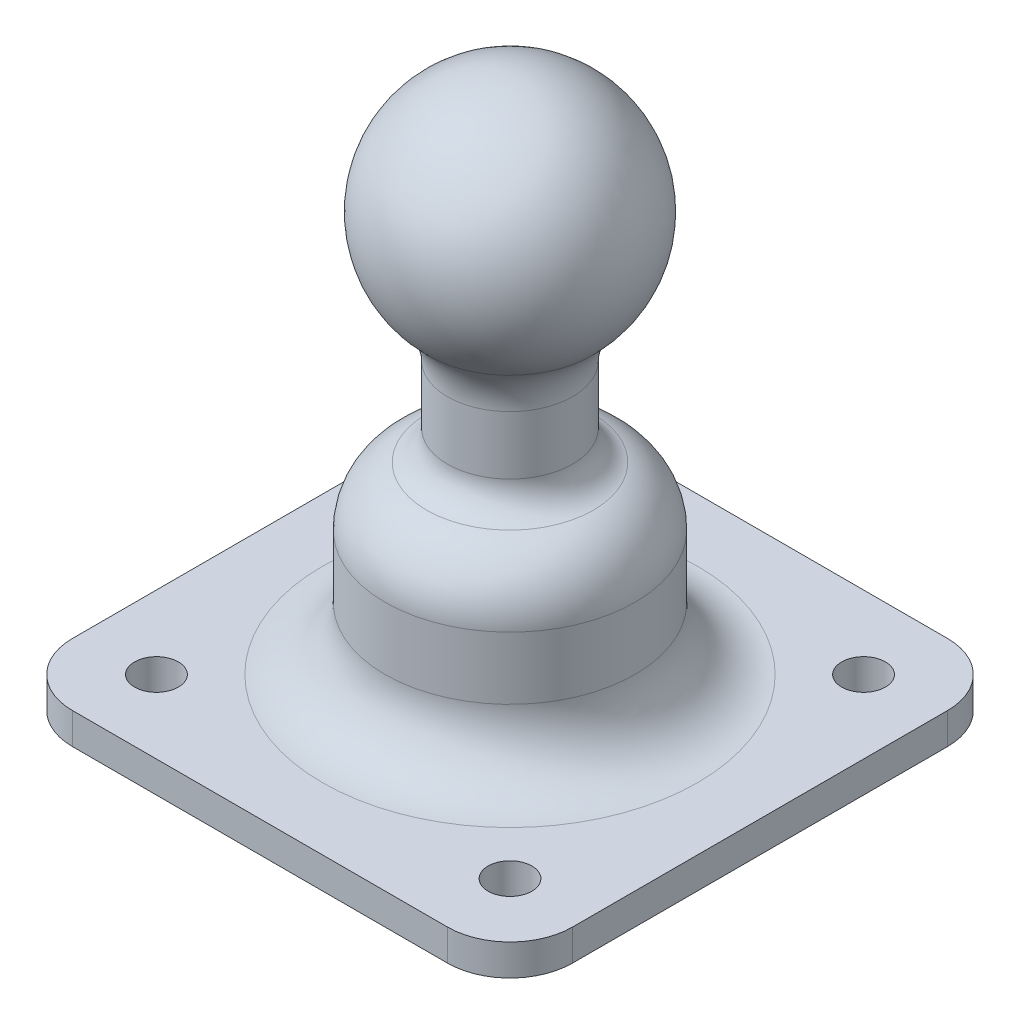
ISO-10303-21;
HEADER;
FILE_DESCRIPTION(('STEP AP214'),'2;1');
FILE_NAME('part.step','',(''),(''),'','','');
FILE_SCHEMA(('AUTOMOTIVE_DESIGN { 1 0 10303 214 1 1 1 1 }'));
ENDSEC;
DATA;
#1=APPLICATION_CONTEXT('core data for automotive mechanical design processes');
#2=APPLICATION_PROTOCOL_DEFINITION('international standard','automotive_design',2000,#1);
#3=PRODUCT_CONTEXT('',#1,'mechanical');
#4=PRODUCT('Part','Part','',(#3));
#5=PRODUCT_RELATED_PRODUCT_CATEGORY('part','',(#4));
#6=PRODUCT_DEFINITION_FORMATION('','',#4);
#7=PRODUCT_DEFINITION_CONTEXT('part definition',#1,'design');
#8=PRODUCT_DEFINITION('design','',#6,#7);
#9=PRODUCT_DEFINITION_SHAPE('','',#8);
#10=(LENGTH_UNIT() NAMED_UNIT(*) SI_UNIT(.MILLI.,.METRE.));
#11=(NAMED_UNIT(*) PLANE_ANGLE_UNIT() SI_UNIT($,.RADIAN.));
#12=(NAMED_UNIT(*) SI_UNIT($,.STERADIAN.) SOLID_ANGLE_UNIT());
#13=UNCERTAINTY_MEASURE_WITH_UNIT(LENGTH_MEASURE(1.E-05),#10,'distance_accuracy_value','');
#14=(GEOMETRIC_REPRESENTATION_CONTEXT(3) GLOBAL_UNCERTAINTY_ASSIGNED_CONTEXT((#13)) GLOBAL_UNIT_ASSIGNED_CONTEXT((#10,
#11,#12)) REPRESENTATION_CONTEXT('',''));
#15=CARTESIAN_POINT('',(0.,0.,0.));
#16=DIRECTION('',(0.,0.,1.));
#17=DIRECTION('',(1.,0.,0.));
#18=AXIS2_PLACEMENT_3D('',#15,#16,#17);
#19=CARTESIAN_POINT('',(-30.,5.,30.));
#20=DIRECTION('',(0.,1.,0.));
#21=DIRECTION('',(0.,0.,1.));
#22=AXIS2_PLACEMENT_3D('',#19,#20,#21);
#23=PLANE('',#22);
#24=CARTESIAN_POINT('',(0.,5.,0.));
#25=DIRECTION('',(0.,1.,0.));
#26=DIRECTION('',(0.,0.,1.));
#27=AXIS2_PLACEMENT_3D('',#24,#25,#26);
#28=CIRCLE('',#27,30.);
#29=CARTESIAN_POINT('',(0.,5.,30.));
#30=VERTEX_POINT('',#29);
#31=EDGE_CURVE('E171',#30,#30,#28,.F.);
#32=ORIENTED_EDGE('',*,*,#31,.T.);
#33=EDGE_LOOP('',(#32));
#34=FACE_BOUND('',#33,.T.);
#35=CARTESIAN_POINT('',(28.2842712474619,5.,28.2842712474619));
#36=DIRECTION('',(0.,1.,0.));
#37=DIRECTION('',(0.,0.,1.));
#38=AXIS2_PLACEMENT_3D('',#35,#36,#37);
#39=CIRCLE('',#38,3.5);
#40=CARTESIAN_POINT('',(28.2842712474619,5.,31.7842712474619));
#41=VERTEX_POINT('',#40);
#42=EDGE_CURVE('E285',#41,#41,#39,.T.);
#43=ORIENTED_EDGE('',*,*,#42,.F.);
#44=EDGE_LOOP('',(#43));
#45=FACE_BOUND('',#44,.T.);
#46=CARTESIAN_POINT('',(-28.2842712474619,5.,-28.2842712474619));
#47=DIRECTION('',(0.,1.,0.));
#48=DIRECTION('',(0.,0.,1.));
#49=AXIS2_PLACEMENT_3D('',#46,#47,#48);
#50=CIRCLE('',#49,3.5);
#51=CARTESIAN_POINT('',(-28.2842712474619,5.,-24.7842712474619));
#52=VERTEX_POINT('',#51);
#53=EDGE_CURVE('E139',#52,#52,#50,.T.);
#54=ORIENTED_EDGE('',*,*,#53,.F.);
#55=EDGE_LOOP('',(#54));
#56=FACE_BOUND('',#55,.T.);
#57=CARTESIAN_POINT('',(-30.,5.,30.));
#58=DIRECTION('',(0.,1.,0.));
#59=DIRECTION('',(0.,0.,1.));
#60=AXIS2_PLACEMENT_3D('',#57,#58,#59);
#61=CIRCLE('',#60,10.);
#62=CARTESIAN_POINT('',(-40.,5.,29.9999999999999));
#63=VERTEX_POINT('',#62);
#64=CARTESIAN_POINT('',(-29.9999999999999,5.,40.));
#65=VERTEX_POINT('',#64);
#66=EDGE_CURVE('E150',#63,#65,#61,.T.);
#67=ORIENTED_EDGE('',*,*,#66,.T.);
#68=DIRECTION('',(1.,0.,0.));
#69=VECTOR('',#68,1.);
#70=CARTESIAN_POINT('',(-29.9999999999999,5.,40.));
#71=LINE('',#70,#69);
#72=CARTESIAN_POINT('',(29.9999999999999,5.,40.));
#73=VERTEX_POINT('',#72);
#74=EDGE_CURVE('E98',#65,#73,#71,.T.);
#75=ORIENTED_EDGE('',*,*,#74,.T.);
#76=CARTESIAN_POINT('',(30.,5.,30.));
#77=DIRECTION('',(0.,1.,0.));
#78=DIRECTION('',(0.,0.,1.));
#79=AXIS2_PLACEMENT_3D('',#76,#77,#78);
#80=CIRCLE('',#79,10.);
#81=CARTESIAN_POINT('',(40.,5.,29.9999999999999));
#82=VERTEX_POINT('',#81);
#83=EDGE_CURVE('E300',#73,#82,#80,.T.);
#84=ORIENTED_EDGE('',*,*,#83,.T.);
#85=DIRECTION('',(0.,0.,-1.));
#86=VECTOR('',#85,1.);
#87=CARTESIAN_POINT('',(40.,5.,-29.9999999999999));
#88=LINE('',#87,#86);
#89=CARTESIAN_POINT('',(40.,5.,-29.9999999999999));
#90=VERTEX_POINT('',#89);
#91=EDGE_CURVE('E302',#82,#90,#88,.T.);
#92=ORIENTED_EDGE('',*,*,#91,.T.);
#93=CARTESIAN_POINT('',(30.,5.,-30.));
#94=DIRECTION('',(0.,1.,0.));
#95=DIRECTION('',(0.,0.,-1.));
#96=AXIS2_PLACEMENT_3D('',#93,#94,#95);
#97=CIRCLE('',#96,10.);
#98=CARTESIAN_POINT('',(29.9999999999999,5.,-40.));
#99=VERTEX_POINT('',#98);
#100=EDGE_CURVE('E117',#90,#99,#97,.T.);
#101=ORIENTED_EDGE('',*,*,#100,.T.);
#102=DIRECTION('',(-1.,0.,0.));
#103=VECTOR('',#102,1.);
#104=CARTESIAN_POINT('',(-29.9999999999999,5.,-40.));
#105=LINE('',#104,#103);
#106=CARTESIAN_POINT('',(-29.9999999999999,5.,-40.));
#107=VERTEX_POINT('',#106);
#108=EDGE_CURVE('E111',#99,#107,#105,.T.);
#109=ORIENTED_EDGE('',*,*,#108,.T.);
#110=CARTESIAN_POINT('',(-30.,5.,-30.));
#111=DIRECTION('',(0.,1.,0.));
#112=DIRECTION('',(0.,0.,1.));
#113=AXIS2_PLACEMENT_3D('',#110,#111,#112);
#114=CIRCLE('',#113,10.);
#115=CARTESIAN_POINT('',(-40.,5.,-29.9999999999999));
#116=VERTEX_POINT('',#115);
#117=EDGE_CURVE('E115',#107,#116,#114,.T.);
#118=ORIENTED_EDGE('',*,*,#117,.T.);
#119=DIRECTION('',(0.,0.,1.));
#120=VECTOR('',#119,1.);
#121=CARTESIAN_POINT('',(-40.,5.,-29.9999999999999));
#122=LINE('',#121,#120);
#123=EDGE_CURVE('E54',#116,#63,#122,.T.);
#124=ORIENTED_EDGE('',*,*,#123,.T.);
#125=EDGE_LOOP('',(#67,#75,#84,#92,#101,#109,#118,#124));
#126=FACE_BOUND('',#125,.T.);
#127=CARTESIAN_POINT('',(28.2842712474619,5.,-28.2842712474619));
#128=DIRECTION('',(0.,1.,0.));
#129=DIRECTION('',(0.,0.,1.));
#130=AXIS2_PLACEMENT_3D('',#127,#128,#129);
#131=CIRCLE('',#130,3.5);
#132=CARTESIAN_POINT('',(28.2842712474619,5.,-24.7842712474619));
#133=VERTEX_POINT('',#132);
#134=EDGE_CURVE('E280',#133,#133,#131,.T.);
#135=ORIENTED_EDGE('',*,*,#134,.F.);
#136=EDGE_LOOP('',(#135));
#137=FACE_BOUND('',#136,.T.);
#138=CARTESIAN_POINT('',(-28.2842712474619,5.,28.2842712474619));
#139=DIRECTION('',(0.,1.,0.));
#140=DIRECTION('',(0.,0.,1.));
#141=AXIS2_PLACEMENT_3D('',#138,#139,#140);
#142=CIRCLE('',#141,3.5);
#143=CARTESIAN_POINT('',(-28.2842712474619,5.,31.7842712474619));
#144=VERTEX_POINT('',#143);
#145=EDGE_CURVE('E323',#144,#144,#142,.T.);
#146=ORIENTED_EDGE('',*,*,#145,.F.);
#147=EDGE_LOOP('',(#146));
#148=FACE_BOUND('',#147,.T.);
#149=ADVANCED_FACE('F37',(#34,#45,#56,#126,#137,#148),#23,.T.);
#150=CARTESIAN_POINT('',(-30.,0.,30.));
#151=DIRECTION('',(0.,1.,0.));
#152=DIRECTION('',(0.,0.,1.));
#153=AXIS2_PLACEMENT_3D('',#150,#151,#152);
#154=PLANE('',#153);
#155=CARTESIAN_POINT('',(-30.,0.,30.));
#156=DIRECTION('',(0.,1.,0.));
#157=DIRECTION('',(0.,0.,1.));
#158=AXIS2_PLACEMENT_3D('',#155,#156,#157);
#159=CIRCLE('',#158,10.);
#160=CARTESIAN_POINT('',(-40.,0.,29.9999999999999));
#161=VERTEX_POINT('',#160);
#162=CARTESIAN_POINT('',(-29.9999999999999,0.,40.));
#163=VERTEX_POINT('',#162);
#164=EDGE_CURVE('E135',#161,#163,#159,.T.);
#165=ORIENTED_EDGE('',*,*,#164,.F.);
#166=DIRECTION('',(0.,0.,1.));
#167=VECTOR('',#166,1.);
#168=CARTESIAN_POINT('',(-40.,0.,-29.9999999999999));
#169=LINE('',#168,#167);
#170=CARTESIAN_POINT('',(-40.,0.,-29.9999999999999));
#171=VERTEX_POINT('',#170);
#172=EDGE_CURVE('E89',#171,#161,#169,.T.);
#173=ORIENTED_EDGE('',*,*,#172,.F.);
#174=CARTESIAN_POINT('',(-30.,0.,-30.));
#175=DIRECTION('',(0.,1.,0.));
#176=DIRECTION('',(0.,0.,1.));
#177=AXIS2_PLACEMENT_3D('',#174,#175,#176);
#178=CIRCLE('',#177,10.);
#179=CARTESIAN_POINT('',(-29.9999999999999,0.,-40.));
#180=VERTEX_POINT('',#179);
#181=EDGE_CURVE('E83',#180,#171,#178,.T.);
#182=ORIENTED_EDGE('',*,*,#181,.F.);
#183=DIRECTION('',(-1.,0.,0.));
#184=VECTOR('',#183,1.);
#185=CARTESIAN_POINT('',(-29.9999999999999,0.,-40.));
#186=LINE('',#185,#184);
#187=CARTESIAN_POINT('',(29.9999999999999,0.,-40.));
#188=VERTEX_POINT('',#187);
#189=EDGE_CURVE('E125',#188,#180,#186,.T.);
#190=ORIENTED_EDGE('',*,*,#189,.F.);
#191=CARTESIAN_POINT('',(30.,0.,-30.));
#192=DIRECTION('',(0.,1.,0.));
#193=DIRECTION('',(0.,0.,-1.));
#194=AXIS2_PLACEMENT_3D('',#191,#192,#193);
#195=CIRCLE('',#194,10.);
#196=CARTESIAN_POINT('',(40.,0.,-29.9999999999999));
#197=VERTEX_POINT('',#196);
#198=EDGE_CURVE('E145',#197,#188,#195,.T.);
#199=ORIENTED_EDGE('',*,*,#198,.F.);
#200=DIRECTION('',(0.,0.,-1.));
#201=VECTOR('',#200,1.);
#202=CARTESIAN_POINT('',(40.,0.,-29.9999999999999));
#203=LINE('',#202,#201);
#204=CARTESIAN_POINT('',(40.,0.,29.9999999999999));
#205=VERTEX_POINT('',#204);
#206=EDGE_CURVE('E143',#205,#197,#203,.T.);
#207=ORIENTED_EDGE('',*,*,#206,.F.);
#208=CARTESIAN_POINT('',(30.,0.,30.));
#209=DIRECTION('',(0.,1.,0.));
#210=DIRECTION('',(0.,0.,1.));
#211=AXIS2_PLACEMENT_3D('',#208,#209,#210);
#212=CIRCLE('',#211,10.);
#213=CARTESIAN_POINT('',(29.9999999999999,0.,40.));
#214=VERTEX_POINT('',#213);
#215=EDGE_CURVE('E141',#214,#205,#212,.T.);
#216=ORIENTED_EDGE('',*,*,#215,.F.);
#217=DIRECTION('',(1.,0.,0.));
#218=VECTOR('',#217,1.);
#219=CARTESIAN_POINT('',(-29.9999999999999,0.,40.));
#220=LINE('',#219,#218);
#221=EDGE_CURVE('E138',#163,#214,#220,.T.);
#222=ORIENTED_EDGE('',*,*,#221,.F.);
#223=EDGE_LOOP('',(#165,#173,#182,#190,#199,#207,#216,#222));
#224=FACE_BOUND('',#223,.T.);
#225=CARTESIAN_POINT('',(-28.2842712474619,0.,-28.2842712474619));
#226=DIRECTION('',(0.,1.,0.));
#227=DIRECTION('',(0.,0.,1.));
#228=AXIS2_PLACEMENT_3D('',#225,#226,#227);
#229=CIRCLE('',#228,3.5);
#230=CARTESIAN_POINT('',(-28.2842712474619,0.,-24.7842712474619));
#231=VERTEX_POINT('',#230);
#232=EDGE_CURVE('E287',#231,#231,#229,.T.);
#233=ORIENTED_EDGE('',*,*,#232,.T.);
#234=EDGE_LOOP('',(#233));
#235=FACE_BOUND('',#234,.T.);
#236=CARTESIAN_POINT('',(28.2842712474619,0.,-28.2842712474619));
#237=DIRECTION('',(0.,1.,0.));
#238=DIRECTION('',(0.,0.,1.));
#239=AXIS2_PLACEMENT_3D('',#236,#237,#238);
#240=CIRCLE('',#239,3.5);
#241=CARTESIAN_POINT('',(28.2842712474619,0.,-24.7842712474619));
#242=VERTEX_POINT('',#241);
#243=EDGE_CURVE('E283',#242,#242,#240,.T.);
#244=ORIENTED_EDGE('',*,*,#243,.T.);
#245=EDGE_LOOP('',(#244));
#246=FACE_BOUND('',#245,.T.);
#247=CARTESIAN_POINT('',(28.2842712474619,0.,28.2842712474619));
#248=DIRECTION('',(0.,1.,0.));
#249=DIRECTION('',(0.,0.,1.));
#250=AXIS2_PLACEMENT_3D('',#247,#248,#249);
#251=CIRCLE('',#250,3.5);
#252=CARTESIAN_POINT('',(28.2842712474619,0.,31.7842712474619));
#253=VERTEX_POINT('',#252);
#254=EDGE_CURVE('E290',#253,#253,#251,.T.);
#255=ORIENTED_EDGE('',*,*,#254,.T.);
#256=EDGE_LOOP('',(#255));
#257=FACE_BOUND('',#256,.T.);
#258=CARTESIAN_POINT('',(-28.2842712474619,0.,28.2842712474619));
#259=DIRECTION('',(0.,1.,0.));
#260=DIRECTION('',(0.,0.,1.));
#261=AXIS2_PLACEMENT_3D('',#258,#259,#260);
#262=CIRCLE('',#261,3.5);
#263=CARTESIAN_POINT('',(-28.2842712474619,0.,31.7842712474619));
#264=VERTEX_POINT('',#263);
#265=EDGE_CURVE('E321',#264,#264,#262,.T.);
#266=ORIENTED_EDGE('',*,*,#265,.T.);
#267=EDGE_LOOP('',(#266));
#268=FACE_BOUND('',#267,.T.);
#269=ADVANCED_FACE('F196',(#224,#235,#246,#257,#268),#154,.F.);
#270=CARTESIAN_POINT('',(-30.,5.,30.));
#271=DIRECTION('',(0.,-1.,0.));
#272=DIRECTION('',(0.,0.,-1.));
#273=AXIS2_PLACEMENT_3D('',#270,#271,#272);
#274=CYLINDRICAL_SURFACE('',#273,10.);
#275=ORIENTED_EDGE('',*,*,#164,.T.);
#276=DIRECTION('',(0.,-1.,0.));
#277=VECTOR('',#276,1.);
#278=CARTESIAN_POINT('',(-29.9999999999999,5.,40.));
#279=LINE('',#278,#277);
#280=EDGE_CURVE('E163',#65,#163,#279,.T.);
#281=ORIENTED_EDGE('',*,*,#280,.F.);
#282=ORIENTED_EDGE('',*,*,#66,.F.);
#283=DIRECTION('',(0.,-1.,0.));
#284=VECTOR('',#283,1.);
#285=CARTESIAN_POINT('',(-40.,5.,29.9999999999999));
#286=LINE('',#285,#284);
#287=EDGE_CURVE('E131',#63,#161,#286,.T.);
#288=ORIENTED_EDGE('',*,*,#287,.T.);
#289=EDGE_LOOP('',(#275,#281,#282,#288));
#290=FACE_BOUND('',#289,.T.);
#291=ADVANCED_FACE('F202',(#290),#274,.T.);
#292=CARTESIAN_POINT('',(-29.9999999999999,5.,40.));
#293=DIRECTION('',(0.,0.,-1.));
#294=DIRECTION('',(-1.,0.,0.));
#295=AXIS2_PLACEMENT_3D('',#292,#293,#294);
#296=PLANE('',#295);
#297=ORIENTED_EDGE('',*,*,#221,.T.);
#298=DIRECTION('',(0.,-1.,0.));
#299=VECTOR('',#298,1.);
#300=CARTESIAN_POINT('',(29.9999999999999,5.,40.));
#301=LINE('',#300,#299);
#302=EDGE_CURVE('E160',#73,#214,#301,.T.);
#303=ORIENTED_EDGE('',*,*,#302,.F.);
#304=ORIENTED_EDGE('',*,*,#74,.F.);
#305=ORIENTED_EDGE('',*,*,#280,.T.);
#306=EDGE_LOOP('',(#297,#303,#304,#305));
#307=FACE_BOUND('',#306,.T.);
#308=ADVANCED_FACE('F228',(#307),#296,.F.);
#309=CARTESIAN_POINT('',(30.,5.,30.));
#310=DIRECTION('',(0.,-1.,0.));
#311=DIRECTION('',(0.,0.,-1.));
#312=AXIS2_PLACEMENT_3D('',#309,#310,#311);
#313=CYLINDRICAL_SURFACE('',#312,10.);
#314=ORIENTED_EDGE('',*,*,#215,.T.);
#315=DIRECTION('',(0.,-1.,0.));
#316=VECTOR('',#315,1.);
#317=CARTESIAN_POINT('',(40.,5.,29.9999999999999));
#318=LINE('',#317,#316);
#319=EDGE_CURVE('E157',#82,#205,#318,.T.);
#320=ORIENTED_EDGE('',*,*,#319,.F.);
#321=ORIENTED_EDGE('',*,*,#83,.F.);
#322=ORIENTED_EDGE('',*,*,#302,.T.);
#323=EDGE_LOOP('',(#314,#320,#321,#322));
#324=FACE_BOUND('',#323,.T.);
#325=ADVANCED_FACE('F224',(#324),#313,.T.);
#326=CARTESIAN_POINT('',(40.,5.,-29.9999999999999));
#327=DIRECTION('',(-1.,0.,0.));
#328=DIRECTION('',(0.,0.,1.));
#329=AXIS2_PLACEMENT_3D('',#326,#327,#328);
#330=PLANE('',#329);
#331=ORIENTED_EDGE('',*,*,#206,.T.);
#332=DIRECTION('',(0.,-1.,0.));
#333=VECTOR('',#332,1.);
#334=CARTESIAN_POINT('',(40.,5.,-29.9999999999999));
#335=LINE('',#334,#333);
#336=EDGE_CURVE('E154',#90,#197,#335,.T.);
#337=ORIENTED_EDGE('',*,*,#336,.F.);
#338=ORIENTED_EDGE('',*,*,#91,.F.);
#339=ORIENTED_EDGE('',*,*,#319,.T.);
#340=EDGE_LOOP('',(#331,#337,#338,#339));
#341=FACE_BOUND('',#340,.T.);
#342=ADVANCED_FACE('F220',(#341),#330,.F.);
#343=CARTESIAN_POINT('',(30.,5.,-30.));
#344=DIRECTION('',(0.,-1.,0.));
#345=DIRECTION('',(0.,0.,-1.));
#346=AXIS2_PLACEMENT_3D('',#343,#344,#345);
#347=CYLINDRICAL_SURFACE('',#346,10.);
#348=ORIENTED_EDGE('',*,*,#198,.T.);
#349=DIRECTION('',(0.,-1.,0.));
#350=VECTOR('',#349,1.);
#351=CARTESIAN_POINT('',(29.9999999999999,5.,-40.));
#352=LINE('',#351,#350);
#353=EDGE_CURVE('E126',#99,#188,#352,.T.);
#354=ORIENTED_EDGE('',*,*,#353,.F.);
#355=ORIENTED_EDGE('',*,*,#100,.F.);
#356=ORIENTED_EDGE('',*,*,#336,.T.);
#357=EDGE_LOOP('',(#348,#354,#355,#356));
#358=FACE_BOUND('',#357,.T.);
#359=ADVANCED_FACE('F217',(#358),#347,.T.);
#360=CARTESIAN_POINT('',(-29.9999999999999,5.,-40.));
#361=DIRECTION('',(0.,0.,1.));
#362=DIRECTION('',(1.,0.,0.));
#363=AXIS2_PLACEMENT_3D('',#360,#361,#362);
#364=PLANE('',#363);
#365=ORIENTED_EDGE('',*,*,#189,.T.);
#366=DIRECTION('',(0.,-1.,0.));
#367=VECTOR('',#366,1.);
#368=CARTESIAN_POINT('',(-29.9999999999999,5.,-40.));
#369=LINE('',#368,#367);
#370=EDGE_CURVE('E122',#107,#180,#369,.T.);
#371=ORIENTED_EDGE('',*,*,#370,.F.);
#372=ORIENTED_EDGE('',*,*,#108,.F.);
#373=ORIENTED_EDGE('',*,*,#353,.T.);
#374=EDGE_LOOP('',(#365,#371,#372,#373));
#375=FACE_BOUND('',#374,.T.);
#376=ADVANCED_FACE('F123',(#375),#364,.F.);
#377=CARTESIAN_POINT('',(-30.,5.,-30.));
#378=DIRECTION('',(0.,-1.,0.));
#379=DIRECTION('',(0.,0.,-1.));
#380=AXIS2_PLACEMENT_3D('',#377,#378,#379);
#381=CYLINDRICAL_SURFACE('',#380,10.);
#382=ORIENTED_EDGE('',*,*,#181,.T.);
#383=DIRECTION('',(0.,-1.,0.));
#384=VECTOR('',#383,1.);
#385=CARTESIAN_POINT('',(-40.,5.,-29.9999999999999));
#386=LINE('',#385,#384);
#387=EDGE_CURVE('E127',#116,#171,#386,.T.);
#388=ORIENTED_EDGE('',*,*,#387,.F.);
#389=ORIENTED_EDGE('',*,*,#117,.F.);
#390=ORIENTED_EDGE('',*,*,#370,.T.);
#391=EDGE_LOOP('',(#382,#388,#389,#390));
#392=FACE_BOUND('',#391,.T.);
#393=ADVANCED_FACE('F129',(#392),#381,.T.);
#394=CARTESIAN_POINT('',(-40.,5.,-29.9999999999999));
#395=DIRECTION('',(1.,0.,0.));
#396=DIRECTION('',(0.,0.,-1.));
#397=AXIS2_PLACEMENT_3D('',#394,#395,#396);
#398=PLANE('',#397);
#399=ORIENTED_EDGE('',*,*,#172,.T.);
#400=ORIENTED_EDGE('',*,*,#287,.F.);
#401=ORIENTED_EDGE('',*,*,#123,.F.);
#402=ORIENTED_EDGE('',*,*,#387,.T.);
#403=EDGE_LOOP('',(#399,#400,#401,#402));
#404=FACE_BOUND('',#403,.T.);
#405=ADVANCED_FACE('F210',(#404),#398,.F.);
#406=CARTESIAN_POINT('',(-28.2842712474619,5.,-28.2842712474619));
#407=DIRECTION('',(0.,-1.,0.));
#408=DIRECTION('',(0.,0.,-1.));
#409=AXIS2_PLACEMENT_3D('',#406,#407,#408);
#410=CYLINDRICAL_SURFACE('',#409,3.5);
#411=ORIENTED_EDGE('',*,*,#53,.T.);
#412=EDGE_LOOP('',(#411));
#413=FACE_BOUND('',#412,.T.);
#414=ORIENTED_EDGE('',*,*,#232,.F.);
#415=EDGE_LOOP('',(#414));
#416=FACE_BOUND('',#415,.T.);
#417=ADVANCED_FACE('F207',(#413,#416),#410,.F.);
#418=CARTESIAN_POINT('',(28.2842712474619,5.,-28.2842712474619));
#419=DIRECTION('',(0.,-1.,0.));
#420=DIRECTION('',(0.,0.,-1.));
#421=AXIS2_PLACEMENT_3D('',#418,#419,#420);
#422=CYLINDRICAL_SURFACE('',#421,3.5);
#423=ORIENTED_EDGE('',*,*,#134,.T.);
#424=EDGE_LOOP('',(#423));
#425=FACE_BOUND('',#424,.T.);
#426=ORIENTED_EDGE('',*,*,#243,.F.);
#427=EDGE_LOOP('',(#426));
#428=FACE_BOUND('',#427,.T.);
#429=ADVANCED_FACE('F269',(#425,#428),#422,.F.);
#430=CARTESIAN_POINT('',(28.2842712474619,5.,28.2842712474619));
#431=DIRECTION('',(0.,-1.,0.));
#432=DIRECTION('',(0.,0.,-1.));
#433=AXIS2_PLACEMENT_3D('',#430,#431,#432);
#434=CYLINDRICAL_SURFACE('',#433,3.5);
#435=ORIENTED_EDGE('',*,*,#42,.T.);
#436=EDGE_LOOP('',(#435));
#437=FACE_BOUND('',#436,.T.);
#438=ORIENTED_EDGE('',*,*,#254,.F.);
#439=EDGE_LOOP('',(#438));
#440=FACE_BOUND('',#439,.T.);
#441=ADVANCED_FACE('F264',(#437,#440),#434,.F.);
#442=CARTESIAN_POINT('',(-28.2842712474619,5.,28.2842712474619));
#443=DIRECTION('',(0.,-1.,0.));
#444=DIRECTION('',(0.,0.,-1.));
#445=AXIS2_PLACEMENT_3D('',#442,#443,#444);
#446=CYLINDRICAL_SURFACE('',#445,3.5);
#447=ORIENTED_EDGE('',*,*,#145,.T.);
#448=EDGE_LOOP('',(#447));
#449=FACE_BOUND('',#448,.T.);
#450=ORIENTED_EDGE('',*,*,#265,.F.);
#451=EDGE_LOOP('',(#450));
#452=FACE_BOUND('',#451,.T.);
#453=ADVANCED_FACE('F257',(#449,#452),#446,.F.);
#454=CARTESIAN_POINT('',(0.,35.,0.));
#455=DIRECTION('',(0.,-1.,0.));
#456=DIRECTION('',(0.,0.,-1.));
#457=AXIS2_PLACEMENT_3D('',#454,#455,#456);
#458=CYLINDRICAL_SURFACE('',#457,20.);
#459=CARTESIAN_POINT('',(0.,25.,0.));
#460=DIRECTION('',(0.,1.,0.));
#461=DIRECTION('',(0.,0.,1.));
#462=AXIS2_PLACEMENT_3D('',#459,#460,#461);
#463=CIRCLE('',#462,20.);
#464=CARTESIAN_POINT('',(0.,25.,20.));
#465=VERTEX_POINT('',#464);
#466=EDGE_CURVE('E168',#465,#465,#463,.F.);
#467=ORIENTED_EDGE('',*,*,#466,.T.);
#468=EDGE_LOOP('',(#467));
#469=FACE_BOUND('',#468,.T.);
#470=CARTESIAN_POINT('',(0.,15.,0.));
#471=DIRECTION('',(0.,1.,0.));
#472=DIRECTION('',(0.,0.,1.));
#473=AXIS2_PLACEMENT_3D('',#470,#471,#472);
#474=CIRCLE('',#473,20.);
#475=CARTESIAN_POINT('',(0.,15.,20.));
#476=VERTEX_POINT('',#475);
#477=EDGE_CURVE('E165',#476,#476,#474,.T.);
#478=ORIENTED_EDGE('',*,*,#477,.T.);
#479=EDGE_LOOP('',(#478));
#480=FACE_BOUND('',#479,.T.);
#481=ADVANCED_FACE('F239',(#469,#480),#458,.T.);
#482=CARTESIAN_POINT('',(0.,25.,0.));
#483=DIRECTION('',(0.,1.,0.));
#484=DIRECTION('',(0.,0.,1.));
#485=AXIS2_PLACEMENT_3D('',#482,#483,#484);
#486=DEGENERATE_TOROIDAL_SURFACE('',#485,10.,10.,.T.);
#487=CARTESIAN_POINT('',(0.,34.4280904158206,0.));
#488=DIRECTION('',(0.,-1.,0.));
#489=DIRECTION('',(0.,0.,-1.));
#490=AXIS2_PLACEMENT_3D('',#487,#488,#489);
#491=CIRCLE('',#490,13.3333333333333);
#492=CARTESIAN_POINT('',(0.,34.4280904158206,-13.3333333333333));
#493=VERTEX_POINT('',#492);
#494=EDGE_CURVE('E177',#493,#493,#491,.T.);
#495=ORIENTED_EDGE('',*,*,#494,.T.);
#496=EDGE_LOOP('',(#495));
#497=FACE_BOUND('',#496,.T.);
#498=ORIENTED_EDGE('',*,*,#466,.F.);
#499=EDGE_LOOP('',(#498));
#500=FACE_BOUND('',#499,.T.);
#501=ADVANCED_FACE('F235',(#497,#500),#486,.T.);
#502=CARTESIAN_POINT('',(0.,15.,0.));
#503=DIRECTION('',(0.,1.,0.));
#504=DIRECTION('',(0.,0.,1.));
#505=AXIS2_PLACEMENT_3D('',#502,#503,#504);
#506=TOROIDAL_SURFACE('',#505,30.,10.);
#507=ORIENTED_EDGE('',*,*,#31,.F.);
#508=EDGE_LOOP('',(#507));
#509=FACE_BOUND('',#508,.T.);
#510=ORIENTED_EDGE('',*,*,#477,.F.);
#511=EDGE_LOOP('',(#510));
#512=FACE_BOUND('',#511,.T.);
#513=ADVANCED_FACE('F238',(#509,#512),#506,.F.);
#514=CARTESIAN_POINT('',(0.,55.,0.));
#515=DIRECTION('',(0.,-1.,0.));
#516=DIRECTION('',(0.,0.,-1.));
#517=AXIS2_PLACEMENT_3D('',#514,#515,#516);
#518=CYLINDRICAL_SURFACE('',#517,10.);
#519=CARTESIAN_POINT('',(0.,48.4887460714081,0.));
#520=DIRECTION('',(0.,1.,0.));
#521=DIRECTION('',(0.,0.,1.));
#522=AXIS2_PLACEMENT_3D('',#519,#520,#521);
#523=CIRCLE('',#522,10.);
#524=CARTESIAN_POINT('',(0.,48.4887460714081,10.));
#525=VERTEX_POINT('',#524);
#526=EDGE_CURVE('E46',#525,#525,#523,.F.);
#527=ORIENTED_EDGE('',*,*,#526,.T.);
#528=EDGE_LOOP('',(#527));
#529=FACE_BOUND('',#528,.T.);
#530=CARTESIAN_POINT('',(0.,39.142135623731,0.));
#531=DIRECTION('',(0.,1.,0.));
#532=DIRECTION('',(0.,0.,1.));
#533=AXIS2_PLACEMENT_3D('',#530,#531,#532);
#534=CIRCLE('',#533,10.);
#535=CARTESIAN_POINT('',(0.,39.142135623731,10.));
#536=VERTEX_POINT('',#535);
#537=EDGE_CURVE('E174',#536,#536,#534,.T.);
#538=ORIENTED_EDGE('',*,*,#537,.T.);
#539=EDGE_LOOP('',(#538));
#540=FACE_BOUND('',#539,.T.);
#541=ADVANCED_FACE('F182',(#529,#540),#518,.T.);
#542=CARTESIAN_POINT('',(0.,39.142135623731,0.));
#543=DIRECTION('',(0.,1.,0.));
#544=DIRECTION('',(0.,0.,1.));
#545=AXIS2_PLACEMENT_3D('',#542,#543,#544);
#546=TOROIDAL_SURFACE('',#545,15.,5.);
#547=ORIENTED_EDGE('',*,*,#494,.F.);
#548=EDGE_LOOP('',(#547));
#549=FACE_BOUND('',#548,.T.);
#550=ORIENTED_EDGE('',*,*,#537,.F.);
#551=EDGE_LOOP('',(#550));
#552=FACE_BOUND('',#551,.T.);
#553=ADVANCED_FACE('F191',(#549,#552),#546,.F.);
#554=CARTESIAN_POINT('',(0.,69.142135623731,0.));
#555=DIRECTION('',(0.,-1.,0.));
#556=DIRECTION('',(-1.,0.,0.));
#557=AXIS2_PLACEMENT_3D('',#554,#555,#556);
#558=SPHERICAL_SURFACE('',#557,18.75);
#559=CARTESIAN_POINT('',(0.,55.6725337417812,0.));
#560=DIRECTION('',(0.,1.,0.));
#561=DIRECTION('',(0.,0.,1.));
#562=AXIS2_PLACEMENT_3D('',#559,#560,#561);
#563=CIRCLE('',#562,13.0434782608696);
#564=CARTESIAN_POINT('',(0.,55.6725337417812,13.0434782608696));
#565=VERTEX_POINT('',#564);
#566=EDGE_CURVE('E11',#565,#565,#563,.T.);
#567=ORIENTED_EDGE('',*,*,#566,.T.);
#568=EDGE_LOOP('',(#567));
#569=FACE_BOUND('',#568,.T.);
#570=ADVANCED_FACE('F186',(#569),#558,.T.);
#571=CARTESIAN_POINT('',(0.,48.4887460714081,0.));
#572=DIRECTION('',(0.,1.,0.));
#573=DIRECTION('',(0.,0.,1.));
#574=AXIS2_PLACEMENT_3D('',#571,#572,#573);
#575=TOROIDAL_SURFACE('',#574,20.,10.);
#576=ORIENTED_EDGE('',*,*,#566,.F.);
#577=EDGE_LOOP('',(#576));
#578=FACE_BOUND('',#577,.T.);
#579=ORIENTED_EDGE('',*,*,#526,.F.);
#580=EDGE_LOOP('',(#579));
#581=FACE_BOUND('',#580,.T.);
#582=ADVANCED_FACE('F39',(#578,#581),#575,.F.);
#583=CLOSED_SHELL('',(#149,#269,#291,#308,#325,#342,#359,#376,#393,#405,#417,#429,#441,#453,
#481,#501,#513,#541,#553,#570,#582));
#584=MANIFOLD_SOLID_BREP('B2',#583);
#585=ADVANCED_BREP_SHAPE_REPRESENTATION('',(#18,#584),#14);
#586=SHAPE_DEFINITION_REPRESENTATION(#9,#585);
ENDSEC;
END-ISO-10303-21;
